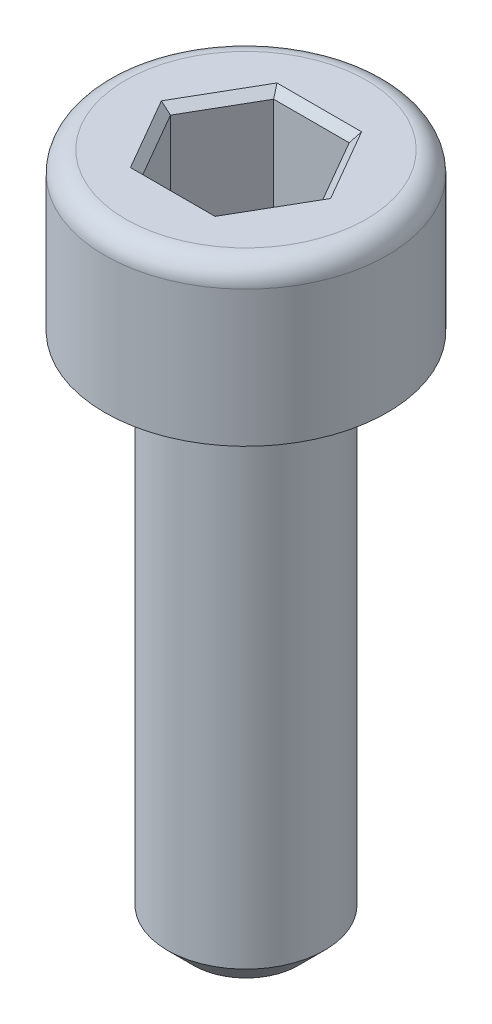
ISO-10303-21;
HEADER;
FILE_DESCRIPTION(('STEP AP214'),'2;1');
FILE_NAME('part.step','',(''),(''),'','','');
FILE_SCHEMA(('AUTOMOTIVE_DESIGN { 1 0 10303 214 1 1 1 1 }'));
ENDSEC;
DATA;
#1=APPLICATION_CONTEXT('core data for automotive mechanical design processes');
#2=APPLICATION_PROTOCOL_DEFINITION('international standard','automotive_design',2000,#1);
#3=PRODUCT_CONTEXT('',#1,'mechanical');
#4=PRODUCT('Part','Part','',(#3));
#5=PRODUCT_RELATED_PRODUCT_CATEGORY('part','',(#4));
#6=PRODUCT_DEFINITION_FORMATION('','',#4);
#7=PRODUCT_DEFINITION_CONTEXT('part definition',#1,'design');
#8=PRODUCT_DEFINITION('design','',#6,#7);
#9=PRODUCT_DEFINITION_SHAPE('','',#8);
#10=(LENGTH_UNIT() NAMED_UNIT(*) SI_UNIT(.MILLI.,.METRE.));
#11=(NAMED_UNIT(*) PLANE_ANGLE_UNIT() SI_UNIT($,.RADIAN.));
#12=(NAMED_UNIT(*) SI_UNIT($,.STERADIAN.) SOLID_ANGLE_UNIT());
#13=UNCERTAINTY_MEASURE_WITH_UNIT(LENGTH_MEASURE(1.E-05),#10,'distance_accuracy_value','');
#14=(GEOMETRIC_REPRESENTATION_CONTEXT(3) GLOBAL_UNCERTAINTY_ASSIGNED_CONTEXT((#13)) GLOBAL_UNIT_ASSIGNED_CONTEXT((#10,
#11,#12)) REPRESENTATION_CONTEXT('',''));
#15=CARTESIAN_POINT('',(0.,0.,0.));
#16=DIRECTION('',(0.,0.,1.));
#17=DIRECTION('',(1.,0.,0.));
#18=AXIS2_PLACEMENT_3D('',#15,#16,#17);
#19=CARTESIAN_POINT('',(0.,3.,0.));
#20=DIRECTION('',(0.,-1.,0.));
#21=DIRECTION('',(0.,0.,-1.));
#22=AXIS2_PLACEMENT_3D('',#19,#20,#21);
#23=PLANE('',#22);
#24=DIRECTION('',(-0.5,0.,-0.866025403784439));
#25=VECTOR('',#24,1.);
#26=CARTESIAN_POINT('',(-1.21243556529822,3.,0.700000000000003));
#27=LINE('',#26,#25);
#28=CARTESIAN_POINT('',(-0.808290376865473,3.,1.40000000000001));
#29=VERTEX_POINT('',#28);
#30=CARTESIAN_POINT('',(-1.61658075373095,3.,0.));
#31=VERTEX_POINT('',#30);
#32=EDGE_CURVE('E179',#29,#31,#27,.T.);
#33=ORIENTED_EDGE('',*,*,#32,.T.);
#34=DIRECTION('',(0.5,0.,-0.866025403784439));
#35=VECTOR('',#34,1.);
#36=CARTESIAN_POINT('',(-1.21243556529821,3.,-0.699999999999997));
#37=LINE('',#36,#35);
#38=CARTESIAN_POINT('',(-0.808290376865473,3.,-1.39999999999999));
#39=VERTEX_POINT('',#38);
#40=EDGE_CURVE('E181',#31,#39,#37,.T.);
#41=ORIENTED_EDGE('',*,*,#40,.T.);
#42=DIRECTION('',(1.,0.,0.));
#43=VECTOR('',#42,1.);
#44=CARTESIAN_POINT('',(0.,3.,-1.39999999999999));
#45=LINE('',#44,#43);
#46=CARTESIAN_POINT('',(0.80829037686548,3.,-1.39999999999999));
#47=VERTEX_POINT('',#46);
#48=EDGE_CURVE('E171',#39,#47,#45,.T.);
#49=ORIENTED_EDGE('',*,*,#48,.T.);
#50=DIRECTION('',(0.5,0.,0.866025403784439));
#51=VECTOR('',#50,1.);
#52=CARTESIAN_POINT('',(1.21243556529821,3.,-0.699999999999999));
#53=LINE('',#52,#51);
#54=CARTESIAN_POINT('',(1.61658075373096,3.,0.));
#55=VERTEX_POINT('',#54);
#56=EDGE_CURVE('E173',#47,#55,#53,.T.);
#57=ORIENTED_EDGE('',*,*,#56,.T.);
#58=DIRECTION('',(-0.5,0.,0.866025403784439));
#59=VECTOR('',#58,1.);
#60=CARTESIAN_POINT('',(1.21243556529822,3.,0.700000000000004));
#61=LINE('',#60,#59);
#62=CARTESIAN_POINT('',(0.808290376865481,3.,1.40000000000001));
#63=VERTEX_POINT('',#62);
#64=EDGE_CURVE('E175',#55,#63,#61,.T.);
#65=ORIENTED_EDGE('',*,*,#64,.T.);
#66=DIRECTION('',(-1.,0.,0.));
#67=VECTOR('',#66,1.);
#68=CARTESIAN_POINT('',(0.,3.,1.40000000000001));
#69=LINE('',#68,#67);
#70=EDGE_CURVE('E177',#63,#29,#69,.T.);
#71=ORIENTED_EDGE('',*,*,#70,.T.);
#72=EDGE_LOOP('',(#33,#41,#49,#57,#65,#71));
#73=FACE_BOUND('',#72,.T.);
#74=CARTESIAN_POINT('',(0.,3.,0.));
#75=DIRECTION('',(0.,1.,0.));
#76=DIRECTION('',(0.,0.,1.));
#77=AXIS2_PLACEMENT_3D('',#74,#75,#76);
#78=CIRCLE('',#77,2.3);
#79=CARTESIAN_POINT('',(0.,3.,2.3));
#80=VERTEX_POINT('',#79);
#81=EDGE_CURVE('E167',#80,#80,#78,.T.);
#82=ORIENTED_EDGE('',*,*,#81,.T.);
#83=EDGE_LOOP('',(#82));
#84=FACE_BOUND('',#83,.T.);
#85=ADVANCED_FACE('F34',(#73,#84),#23,.F.);
#86=CARTESIAN_POINT('',(0.,2.6,0.));
#87=DIRECTION('',(0.,1.,0.));
#88=DIRECTION('',(0.,0.,1.));
#89=AXIS2_PLACEMENT_3D('',#86,#87,#88);
#90=TOROIDAL_SURFACE('',#89,2.3,0.4);
#91=ORIENTED_EDGE('',*,*,#81,.F.);
#92=EDGE_LOOP('',(#91));
#93=FACE_BOUND('',#92,.T.);
#94=CARTESIAN_POINT('',(0.,2.6,0.));
#95=DIRECTION('',(0.,1.,0.));
#96=DIRECTION('',(0.,0.,1.));
#97=AXIS2_PLACEMENT_3D('',#94,#95,#96);
#98=CIRCLE('',#97,2.7);
#99=CARTESIAN_POINT('',(0.,2.6,2.7));
#100=VERTEX_POINT('',#99);
#101=EDGE_CURVE('E164',#100,#100,#98,.T.);
#102=ORIENTED_EDGE('',*,*,#101,.T.);
#103=EDGE_LOOP('',(#102));
#104=FACE_BOUND('',#103,.T.);
#105=ADVANCED_FACE('F235',(#93,#104),#90,.T.);
#106=CARTESIAN_POINT('',(0.,6.97297297297297,0.));
#107=DIRECTION('',(0.,1.,0.));
#108=DIRECTION('',(0.,0.,1.));
#109=AXIS2_PLACEMENT_3D('',#106,#107,#108);
#110=CYLINDRICAL_SURFACE('',#109,2.7);
#111=ORIENTED_EDGE('',*,*,#101,.F.);
#112=EDGE_LOOP('',(#111));
#113=FACE_BOUND('',#112,.T.);
#114=CARTESIAN_POINT('',(0.,0.,0.));
#115=DIRECTION('',(0.,1.,0.));
#116=DIRECTION('',(0.,0.,1.));
#117=AXIS2_PLACEMENT_3D('',#114,#115,#116);
#118=CIRCLE('',#117,2.7);
#119=CARTESIAN_POINT('',(0.,0.,2.7));
#120=VERTEX_POINT('',#119);
#121=EDGE_CURVE('E161',#120,#120,#118,.T.);
#122=ORIENTED_EDGE('',*,*,#121,.T.);
#123=EDGE_LOOP('',(#122));
#124=FACE_BOUND('',#123,.T.);
#125=ADVANCED_FACE('F241',(#113,#124),#110,.T.);
#126=CARTESIAN_POINT('',(2.7,0.,0.));
#127=DIRECTION('',(0.,1.,0.));
#128=DIRECTION('',(0.,0.,1.));
#129=AXIS2_PLACEMENT_3D('',#126,#127,#128);
#130=PLANE('',#129);
#131=ORIENTED_EDGE('',*,*,#121,.F.);
#132=EDGE_LOOP('',(#131));
#133=FACE_BOUND('',#132,.T.);
#134=CARTESIAN_POINT('',(0.,0.,0.));
#135=DIRECTION('',(0.,1.,0.));
#136=DIRECTION('',(0.,0.,1.));
#137=AXIS2_PLACEMENT_3D('',#134,#135,#136);
#138=CIRCLE('',#137,1.5);
#139=CARTESIAN_POINT('',(0.,0.,1.5));
#140=VERTEX_POINT('',#139);
#141=EDGE_CURVE('E158',#140,#140,#138,.T.);
#142=ORIENTED_EDGE('',*,*,#141,.T.);
#143=EDGE_LOOP('',(#142));
#144=FACE_BOUND('',#143,.T.);
#145=ADVANCED_FACE('F371',(#133,#144),#130,.F.);
#146=CARTESIAN_POINT('',(0.,6.97297297297297,0.));
#147=DIRECTION('',(0.,1.,0.));
#148=DIRECTION('',(0.,0.,1.));
#149=AXIS2_PLACEMENT_3D('',#146,#147,#148);
#150=CYLINDRICAL_SURFACE('',#149,1.5);
#151=ORIENTED_EDGE('',*,*,#141,.F.);
#152=EDGE_LOOP('',(#151));
#153=FACE_BOUND('',#152,.T.);
#154=CARTESIAN_POINT('',(0.,-9.5,0.));
#155=DIRECTION('',(0.,1.,0.));
#156=DIRECTION('',(0.,0.,1.));
#157=AXIS2_PLACEMENT_3D('',#154,#155,#156);
#158=CIRCLE('',#157,1.5);
#159=CARTESIAN_POINT('',(0.,-9.5,1.5));
#160=VERTEX_POINT('',#159);
#161=EDGE_CURVE('E155',#160,#160,#158,.T.);
#162=ORIENTED_EDGE('',*,*,#161,.T.);
#163=EDGE_LOOP('',(#162));
#164=FACE_BOUND('',#163,.T.);
#165=ADVANCED_FACE('F362',(#153,#164),#150,.T.);
#166=CARTESIAN_POINT('',(0.,-10.,0.));
#167=DIRECTION('',(0.,1.,0.));
#168=DIRECTION('',(0.,0.,1.));
#169=AXIS2_PLACEMENT_3D('',#166,#167,#168);
#170=CONICAL_SURFACE('',#169,1.,0.785398163397448);
#171=ORIENTED_EDGE('',*,*,#161,.F.);
#172=EDGE_LOOP('',(#171));
#173=FACE_BOUND('',#172,.T.);
#174=CARTESIAN_POINT('',(0.,-10.,0.));
#175=DIRECTION('',(0.,1.,0.));
#176=DIRECTION('',(0.,0.,1.));
#177=AXIS2_PLACEMENT_3D('',#174,#175,#176);
#178=CIRCLE('',#177,1.);
#179=CARTESIAN_POINT('',(0.,-10.,1.));
#180=VERTEX_POINT('',#179);
#181=EDGE_CURVE('E145',#180,#180,#178,.T.);
#182=ORIENTED_EDGE('',*,*,#181,.T.);
#183=EDGE_LOOP('',(#182));
#184=FACE_BOUND('',#183,.T.);
#185=ADVANCED_FACE('F357',(#173,#184),#170,.T.);
#186=CARTESIAN_POINT('',(1.,-10.,0.));
#187=DIRECTION('',(0.,1.,0.));
#188=DIRECTION('',(0.,0.,1.));
#189=AXIS2_PLACEMENT_3D('',#186,#187,#188);
#190=PLANE('',#189);
#191=ORIENTED_EDGE('',*,*,#181,.F.);
#192=EDGE_LOOP('',(#191));
#193=FACE_BOUND('',#192,.T.);
#194=ADVANCED_FACE('F332',(#193),#190,.F.);
#195=CARTESIAN_POINT('',(-0.721687836487029,1.,-1.24999999999999));
#196=DIRECTION('',(-0.866025403784439,0.,-0.5));
#197=DIRECTION('',(-0.5,0.,0.866025403784439));
#198=AXIS2_PLACEMENT_3D('',#195,#196,#197);
#199=PLANE('',#198);
#200=DIRECTION('',(0.,1.,0.));
#201=VECTOR('',#200,1.);
#202=CARTESIAN_POINT('',(-0.721687836487029,1.,-1.24999999999999));
#203=LINE('',#202,#201);
#204=CARTESIAN_POINT('',(-0.721687836487029,1.,-1.24999999999999));
#205=VERTEX_POINT('',#204);
#206=CARTESIAN_POINT('',(-0.721687836487029,2.85,-1.24999999999999));
#207=VERTEX_POINT('',#206);
#208=EDGE_CURVE('E143',#205,#207,#203,.T.);
#209=ORIENTED_EDGE('',*,*,#208,.T.);
#210=DIRECTION('',(-0.5,0.,0.866025403784439));
#211=VECTOR('',#210,1.);
#212=CARTESIAN_POINT('',(-0.721687836487029,2.85,-1.24999999999999));
#213=LINE('',#212,#211);
#214=CARTESIAN_POINT('',(-1.44337567297406,2.85,0.));
#215=VERTEX_POINT('',#214);
#216=EDGE_CURVE('E115',#207,#215,#213,.T.);
#217=ORIENTED_EDGE('',*,*,#216,.T.);
#218=DIRECTION('',(0.,1.,0.));
#219=VECTOR('',#218,1.);
#220=CARTESIAN_POINT('',(-1.44337567297406,1.,0.));
#221=LINE('',#220,#219);
#222=CARTESIAN_POINT('',(-1.44337567297406,1.,0.));
#223=VERTEX_POINT('',#222);
#224=EDGE_CURVE('E107',#223,#215,#221,.T.);
#225=ORIENTED_EDGE('',*,*,#224,.F.);
#226=DIRECTION('',(-0.5,0.,0.866025403784439));
#227=VECTOR('',#226,1.);
#228=CARTESIAN_POINT('',(-0.721687836487029,1.,-1.24999999999999));
#229=LINE('',#228,#227);
#230=EDGE_CURVE('E112',#205,#223,#229,.T.);
#231=ORIENTED_EDGE('',*,*,#230,.F.);
#232=EDGE_LOOP('',(#209,#217,#225,#231));
#233=FACE_BOUND('',#232,.T.);
#234=ADVANCED_FACE('F110',(#233),#199,.F.);
#235=CARTESIAN_POINT('',(0.721687836487036,1.,-1.24999999999999));
#236=DIRECTION('',(0.,0.,-1.));
#237=DIRECTION('',(-1.,0.,0.));
#238=AXIS2_PLACEMENT_3D('',#235,#236,#237);
#239=PLANE('',#238);
#240=DIRECTION('',(0.,1.,0.));
#241=VECTOR('',#240,1.);
#242=CARTESIAN_POINT('',(0.721687836487036,1.,-1.24999999999999));
#243=LINE('',#242,#241);
#244=CARTESIAN_POINT('',(0.721687836487036,1.,-1.24999999999999));
#245=VERTEX_POINT('',#244);
#246=CARTESIAN_POINT('',(0.721687836487036,2.85,-1.24999999999999));
#247=VERTEX_POINT('',#246);
#248=EDGE_CURVE('E146',#245,#247,#243,.T.);
#249=ORIENTED_EDGE('',*,*,#248,.T.);
#250=DIRECTION('',(-1.,0.,0.));
#251=VECTOR('',#250,1.);
#252=CARTESIAN_POINT('',(0.721687836487036,2.85,-1.24999999999999));
#253=LINE('',#252,#251);
#254=EDGE_CURVE('E11',#247,#207,#253,.T.);
#255=ORIENTED_EDGE('',*,*,#254,.T.);
#256=ORIENTED_EDGE('',*,*,#208,.F.);
#257=DIRECTION('',(-1.,0.,0.));
#258=VECTOR('',#257,1.);
#259=CARTESIAN_POINT('',(0.721687836487036,1.,-1.24999999999999));
#260=LINE('',#259,#258);
#261=EDGE_CURVE('E118',#245,#205,#260,.T.);
#262=ORIENTED_EDGE('',*,*,#261,.F.);
#263=EDGE_LOOP('',(#249,#255,#256,#262));
#264=FACE_BOUND('',#263,.T.);
#265=ADVANCED_FACE('F219',(#264),#239,.F.);
#266=CARTESIAN_POINT('',(1.44337567297407,1.,0.));
#267=DIRECTION('',(0.866025403784438,0.,-0.5));
#268=DIRECTION('',(-0.5,0.,-0.866025403784438));
#269=AXIS2_PLACEMENT_3D('',#266,#267,#268);
#270=PLANE('',#269);
#271=DIRECTION('',(0.,1.,0.));
#272=VECTOR('',#271,1.);
#273=CARTESIAN_POINT('',(1.44337567297407,1.,0.));
#274=LINE('',#273,#272);
#275=CARTESIAN_POINT('',(1.44337567297407,1.,0.));
#276=VERTEX_POINT('',#275);
#277=CARTESIAN_POINT('',(1.44337567297407,2.85,0.));
#278=VERTEX_POINT('',#277);
#279=EDGE_CURVE('E148',#276,#278,#274,.T.);
#280=ORIENTED_EDGE('',*,*,#279,.T.);
#281=DIRECTION('',(-0.5,0.,-0.866025403784438));
#282=VECTOR('',#281,1.);
#283=CARTESIAN_POINT('',(1.44337567297407,2.85,0.));
#284=LINE('',#283,#282);
#285=EDGE_CURVE('E43',#278,#247,#284,.T.);
#286=ORIENTED_EDGE('',*,*,#285,.T.);
#287=ORIENTED_EDGE('',*,*,#248,.F.);
#288=DIRECTION('',(-0.5,0.,-0.866025403784438));
#289=VECTOR('',#288,1.);
#290=CARTESIAN_POINT('',(1.44337567297407,1.,0.));
#291=LINE('',#290,#289);
#292=EDGE_CURVE('E140',#276,#245,#291,.T.);
#293=ORIENTED_EDGE('',*,*,#292,.F.);
#294=EDGE_LOOP('',(#280,#286,#287,#293));
#295=FACE_BOUND('',#294,.T.);
#296=ADVANCED_FACE('F221',(#295),#270,.F.);
#297=CARTESIAN_POINT('',(0.721687836487036,1.,1.25000000000001));
#298=DIRECTION('',(0.866025403784439,0.,0.5));
#299=DIRECTION('',(0.5,0.,-0.866025403784439));
#300=AXIS2_PLACEMENT_3D('',#297,#298,#299);
#301=PLANE('',#300);
#302=DIRECTION('',(0.,1.,0.));
#303=VECTOR('',#302,1.);
#304=CARTESIAN_POINT('',(0.721687836487036,1.,1.25000000000001));
#305=LINE('',#304,#303);
#306=CARTESIAN_POINT('',(0.721687836487036,1.,1.25000000000001));
#307=VERTEX_POINT('',#306);
#308=CARTESIAN_POINT('',(0.721687836487036,2.85,1.25000000000001));
#309=VERTEX_POINT('',#308);
#310=EDGE_CURVE('E150',#307,#309,#305,.T.);
#311=ORIENTED_EDGE('',*,*,#310,.T.);
#312=DIRECTION('',(0.5,0.,-0.866025403784439));
#313=VECTOR('',#312,1.);
#314=CARTESIAN_POINT('',(0.721687836487036,2.85,1.25000000000001));
#315=LINE('',#314,#313);
#316=EDGE_CURVE('E58',#309,#278,#315,.T.);
#317=ORIENTED_EDGE('',*,*,#316,.T.);
#318=ORIENTED_EDGE('',*,*,#279,.F.);
#319=DIRECTION('',(0.5,0.,-0.866025403784439));
#320=VECTOR('',#319,1.);
#321=CARTESIAN_POINT('',(0.721687836487036,1.,1.25000000000001));
#322=LINE('',#321,#320);
#323=EDGE_CURVE('E137',#307,#276,#322,.T.);
#324=ORIENTED_EDGE('',*,*,#323,.F.);
#325=EDGE_LOOP('',(#311,#317,#318,#324));
#326=FACE_BOUND('',#325,.T.);
#327=ADVANCED_FACE('F223',(#326),#301,.F.);
#328=CARTESIAN_POINT('',(-0.721687836487028,1.,1.25000000000001));
#329=DIRECTION('',(0.,0.,1.));
#330=DIRECTION('',(1.,0.,0.));
#331=AXIS2_PLACEMENT_3D('',#328,#329,#330);
#332=PLANE('',#331);
#333=DIRECTION('',(0.,1.,0.));
#334=VECTOR('',#333,1.);
#335=CARTESIAN_POINT('',(-0.721687836487028,1.,1.25000000000001));
#336=LINE('',#335,#334);
#337=CARTESIAN_POINT('',(-0.721687836487028,1.,1.25000000000001));
#338=VERTEX_POINT('',#337);
#339=CARTESIAN_POINT('',(-0.721687836487028,2.85,1.25000000000001));
#340=VERTEX_POINT('',#339);
#341=EDGE_CURVE('E117',#338,#340,#336,.T.);
#342=ORIENTED_EDGE('',*,*,#341,.T.);
#343=DIRECTION('',(1.,0.,0.));
#344=VECTOR('',#343,1.);
#345=CARTESIAN_POINT('',(-0.721687836487028,2.85,1.25000000000001));
#346=LINE('',#345,#344);
#347=EDGE_CURVE('E186',#340,#309,#346,.T.);
#348=ORIENTED_EDGE('',*,*,#347,.T.);
#349=ORIENTED_EDGE('',*,*,#310,.F.);
#350=DIRECTION('',(1.,0.,0.));
#351=VECTOR('',#350,1.);
#352=CARTESIAN_POINT('',(-0.721687836487028,1.,1.25000000000001));
#353=LINE('',#352,#351);
#354=EDGE_CURVE('E127',#338,#307,#353,.T.);
#355=ORIENTED_EDGE('',*,*,#354,.F.);
#356=EDGE_LOOP('',(#342,#348,#349,#355));
#357=FACE_BOUND('',#356,.T.);
#358=ADVANCED_FACE('F225',(#357),#332,.F.);
#359=CARTESIAN_POINT('',(-1.44337567297406,1.,0.));
#360=DIRECTION('',(-0.866025403784439,0.,0.5));
#361=DIRECTION('',(0.5,0.,0.866025403784439));
#362=AXIS2_PLACEMENT_3D('',#359,#360,#361);
#363=PLANE('',#362);
#364=ORIENTED_EDGE('',*,*,#224,.T.);
#365=DIRECTION('',(0.5,0.,0.866025403784439));
#366=VECTOR('',#365,1.);
#367=CARTESIAN_POINT('',(-1.44337567297406,2.85,0.));
#368=LINE('',#367,#366);
#369=EDGE_CURVE('E184',#215,#340,#368,.T.);
#370=ORIENTED_EDGE('',*,*,#369,.T.);
#371=ORIENTED_EDGE('',*,*,#341,.F.);
#372=DIRECTION('',(0.5,0.,0.866025403784439));
#373=VECTOR('',#372,1.);
#374=CARTESIAN_POINT('',(-1.44337567297406,1.,0.));
#375=LINE('',#374,#373);
#376=EDGE_CURVE('E121',#223,#338,#375,.T.);
#377=ORIENTED_EDGE('',*,*,#376,.F.);
#378=EDGE_LOOP('',(#364,#370,#371,#377));
#379=FACE_BOUND('',#378,.T.);
#380=ADVANCED_FACE('F122',(#379),#363,.F.);
#381=CARTESIAN_POINT('',(0.,1.,0.));
#382=DIRECTION('',(0.,1.,0.));
#383=DIRECTION('',(0.,0.,1.));
#384=AXIS2_PLACEMENT_3D('',#381,#382,#383);
#385=PLANE('',#384);
#386=ORIENTED_EDGE('',*,*,#230,.T.);
#387=ORIENTED_EDGE('',*,*,#376,.T.);
#388=ORIENTED_EDGE('',*,*,#354,.T.);
#389=ORIENTED_EDGE('',*,*,#323,.T.);
#390=ORIENTED_EDGE('',*,*,#292,.T.);
#391=ORIENTED_EDGE('',*,*,#261,.T.);
#392=EDGE_LOOP('',(#386,#387,#388,#389,#390,#391));
#393=FACE_BOUND('',#392,.T.);
#394=ADVANCED_FACE('F129',(#393),#385,.T.);
#395=CARTESIAN_POINT('',(0.721687836487036,2.85,1.25000000000001));
#396=DIRECTION('',(0.612372435695795,-0.707106781186548,0.353553390593274));
#397=DIRECTION('',(0.5,0.,-0.866025403784439));
#398=AXIS2_PLACEMENT_3D('',#395,#396,#397);
#399=PLANE('',#398);
#400=DIRECTION('',(0.377964473009227,0.654653670707977,0.654653670707977));
#401=VECTOR('',#400,1.);
#402=CARTESIAN_POINT('',(0.515491311776455,2.49285714285714,0.892857142857154));
#403=LINE('',#402,#401);
#404=EDGE_CURVE('E134',#63,#309,#403,.F.);
#405=ORIENTED_EDGE('',*,*,#404,.F.);
#406=ORIENTED_EDGE('',*,*,#64,.F.);
#407=DIRECTION('',(0.755928946018454,0.654653670707977,0.));
#408=VECTOR('',#407,1.);
#409=CARTESIAN_POINT('',(1.03098262355291,2.49285714285714,0.));
#410=LINE('',#409,#408);
#411=EDGE_CURVE('E38',#278,#55,#410,.T.);
#412=ORIENTED_EDGE('',*,*,#411,.F.);
#413=ORIENTED_EDGE('',*,*,#316,.F.);
#414=EDGE_LOOP('',(#405,#406,#412,#413));
#415=FACE_BOUND('',#414,.T.);
#416=ADVANCED_FACE('F36',(#415),#399,.F.);
#417=CARTESIAN_POINT('',(1.44337567297407,2.85,0.));
#418=DIRECTION('',(0.612372435695794,-0.707106781186547,-0.353553390593274));
#419=DIRECTION('',(-0.5,0.,-0.866025403784438));
#420=AXIS2_PLACEMENT_3D('',#417,#418,#419);
#421=PLANE('',#420);
#422=ORIENTED_EDGE('',*,*,#411,.T.);
#423=ORIENTED_EDGE('',*,*,#56,.F.);
#424=DIRECTION('',(0.377964473009227,0.654653670707977,-0.654653670707977));
#425=VECTOR('',#424,1.);
#426=CARTESIAN_POINT('',(0.515491311776455,2.49285714285714,-0.892857142857133));
#427=LINE('',#426,#425);
#428=EDGE_CURVE('E197',#247,#47,#427,.T.);
#429=ORIENTED_EDGE('',*,*,#428,.F.);
#430=ORIENTED_EDGE('',*,*,#285,.F.);
#431=EDGE_LOOP('',(#422,#423,#429,#430));
#432=FACE_BOUND('',#431,.T.);
#433=ADVANCED_FACE('F212',(#432),#421,.F.);
#434=CARTESIAN_POINT('',(-0.721687836487028,2.85,1.25000000000001));
#435=DIRECTION('',(0.,-0.707106781186548,0.707106781186548));
#436=DIRECTION('',(1.,0.,0.));
#437=AXIS2_PLACEMENT_3D('',#434,#435,#436);
#438=PLANE('',#437);
#439=ORIENTED_EDGE('',*,*,#404,.T.);
#440=ORIENTED_EDGE('',*,*,#347,.F.);
#441=DIRECTION('',(-0.377964473009229,0.654653670707977,0.654653670707977));
#442=VECTOR('',#441,1.);
#443=CARTESIAN_POINT('',(-0.515491311776447,2.49285714285714,0.892857142857156));
#444=LINE('',#443,#442);
#445=EDGE_CURVE('E194',#29,#340,#444,.F.);
#446=ORIENTED_EDGE('',*,*,#445,.F.);
#447=ORIENTED_EDGE('',*,*,#70,.F.);
#448=EDGE_LOOP('',(#439,#440,#446,#447));
#449=FACE_BOUND('',#448,.T.);
#450=ADVANCED_FACE('F204',(#449),#438,.F.);
#451=CARTESIAN_POINT('',(0.721687836487036,2.85,-1.24999999999999));
#452=DIRECTION('',(0.,-0.707106781186547,-0.707106781186548));
#453=DIRECTION('',(-1.,0.,0.));
#454=AXIS2_PLACEMENT_3D('',#451,#452,#453);
#455=PLANE('',#454);
#456=ORIENTED_EDGE('',*,*,#428,.T.);
#457=ORIENTED_EDGE('',*,*,#48,.F.);
#458=DIRECTION('',(0.377964473009228,-0.654653670707977,0.654653670707976));
#459=VECTOR('',#458,1.);
#460=CARTESIAN_POINT('',(-0.721687836487029,2.85,-1.24999999999999));
#461=LINE('',#460,#459);
#462=EDGE_CURVE('E192',#207,#39,#461,.F.);
#463=ORIENTED_EDGE('',*,*,#462,.F.);
#464=ORIENTED_EDGE('',*,*,#254,.F.);
#465=EDGE_LOOP('',(#456,#457,#463,#464));
#466=FACE_BOUND('',#465,.T.);
#467=ADVANCED_FACE('F217',(#466),#455,.F.);
#468=CARTESIAN_POINT('',(-1.44337567297406,2.85,0.));
#469=DIRECTION('',(-0.612372435695794,-0.707106781186549,0.353553390593273));
#470=DIRECTION('',(0.5,0.,0.866025403784439));
#471=AXIS2_PLACEMENT_3D('',#468,#469,#470);
#472=PLANE('',#471);
#473=ORIENTED_EDGE('',*,*,#445,.T.);
#474=ORIENTED_EDGE('',*,*,#369,.F.);
#475=DIRECTION('',(-0.755928946018455,0.654653670707977,0.));
#476=VECTOR('',#475,1.);
#477=CARTESIAN_POINT('',(-1.0309826235529,2.49285714285714,0.));
#478=LINE('',#477,#476);
#479=EDGE_CURVE('E190',#31,#215,#478,.F.);
#480=ORIENTED_EDGE('',*,*,#479,.F.);
#481=ORIENTED_EDGE('',*,*,#32,.F.);
#482=EDGE_LOOP('',(#473,#474,#480,#481));
#483=FACE_BOUND('',#482,.T.);
#484=ADVANCED_FACE('F250',(#483),#472,.F.);
#485=CARTESIAN_POINT('',(-0.721687836487029,2.85,-1.24999999999999));
#486=DIRECTION('',(-0.612372435695794,-0.707106781186548,-0.353553390593273));
#487=DIRECTION('',(-0.5,0.,0.866025403784439));
#488=AXIS2_PLACEMENT_3D('',#485,#486,#487);
#489=PLANE('',#488);
#490=ORIENTED_EDGE('',*,*,#462,.T.);
#491=ORIENTED_EDGE('',*,*,#40,.F.);
#492=ORIENTED_EDGE('',*,*,#479,.T.);
#493=ORIENTED_EDGE('',*,*,#216,.F.);
#494=EDGE_LOOP('',(#490,#491,#492,#493));
#495=FACE_BOUND('',#494,.T.);
#496=ADVANCED_FACE('F247',(#495),#489,.F.);
#497=CLOSED_SHELL('',(#85,#105,#125,#145,#165,#185,#194,#234,#265,#296,#327,#358,#380,#394,#416,
#433,#450,#467,#484,#496));
#498=MANIFOLD_SOLID_BREP('B2',#497);
#499=ADVANCED_BREP_SHAPE_REPRESENTATION('',(#18,#498),#14);
#500=SHAPE_DEFINITION_REPRESENTATION(#9,#499);
ENDSEC;
END-ISO-10303-21;
